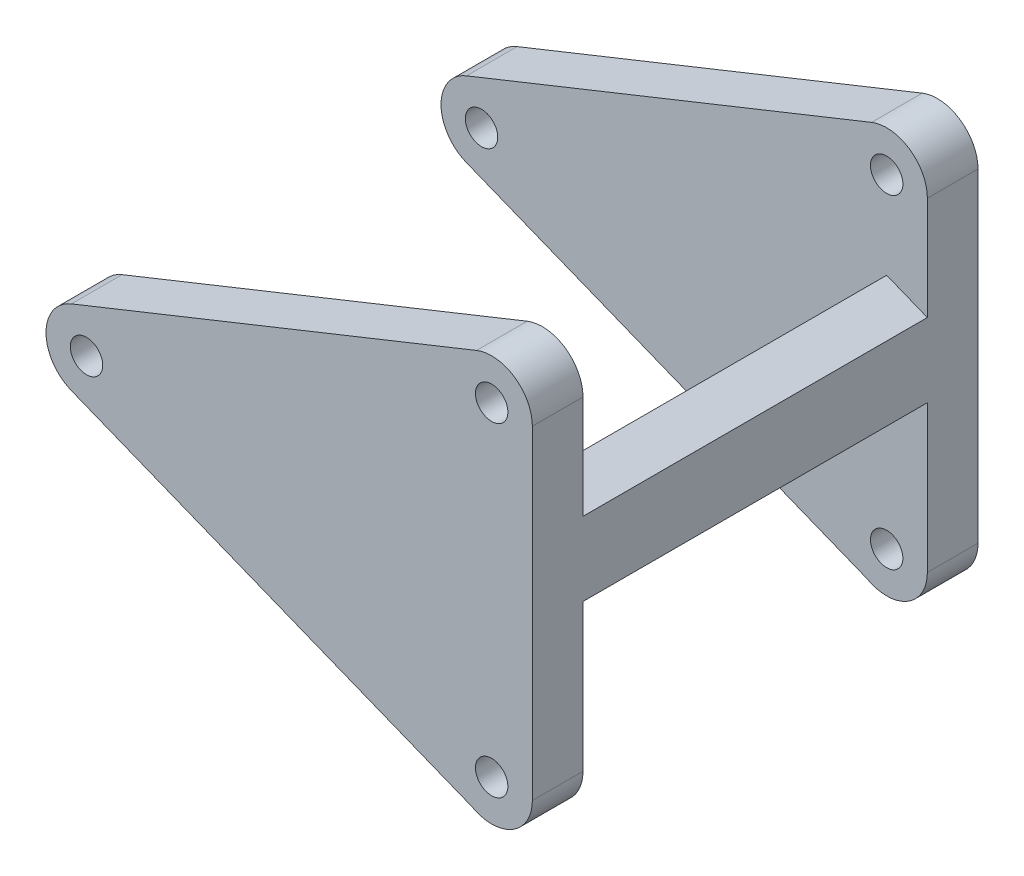
ISO-10303-21;
HEADER;
FILE_DESCRIPTION(('STEP AP214'),'2;1');
FILE_NAME('part.step','',(''),(''),'','','');
FILE_SCHEMA(('AUTOMOTIVE_DESIGN { 1 0 10303 214 1 1 1 1 }'));
ENDSEC;
DATA;
#1=APPLICATION_CONTEXT('core data for automotive mechanical design processes');
#2=APPLICATION_PROTOCOL_DEFINITION('international standard','automotive_design',2000,#1);
#3=PRODUCT_CONTEXT('',#1,'mechanical');
#4=PRODUCT('Part','Part','',(#3));
#5=PRODUCT_RELATED_PRODUCT_CATEGORY('part','',(#4));
#6=PRODUCT_DEFINITION_FORMATION('','',#4);
#7=PRODUCT_DEFINITION_CONTEXT('part definition',#1,'design');
#8=PRODUCT_DEFINITION('design','',#6,#7);
#9=PRODUCT_DEFINITION_SHAPE('','',#8);
#10=(LENGTH_UNIT() NAMED_UNIT(*) SI_UNIT(.MILLI.,.METRE.));
#11=(NAMED_UNIT(*) PLANE_ANGLE_UNIT() SI_UNIT($,.RADIAN.));
#12=(NAMED_UNIT(*) SI_UNIT($,.STERADIAN.) SOLID_ANGLE_UNIT());
#13=UNCERTAINTY_MEASURE_WITH_UNIT(LENGTH_MEASURE(1.E-05),#10,'distance_accuracy_value','');
#14=(GEOMETRIC_REPRESENTATION_CONTEXT(3) GLOBAL_UNCERTAINTY_ASSIGNED_CONTEXT((#13)) GLOBAL_UNIT_ASSIGNED_CONTEXT((#10,
#11,#12)) REPRESENTATION_CONTEXT('',''));
#15=CARTESIAN_POINT('',(0.,0.,0.));
#16=DIRECTION('',(0.,0.,1.));
#17=DIRECTION('',(1.,0.,0.));
#18=AXIS2_PLACEMENT_3D('',#15,#16,#17);
#19=CARTESIAN_POINT('',(30.,-20.,0.));
#20=DIRECTION('',(0.,0.,1.));
#21=DIRECTION('',(1.,0.,0.));
#22=AXIS2_PLACEMENT_3D('',#19,#20,#21);
#23=CYLINDRICAL_SURFACE('',#22,2.);
#24=CARTESIAN_POINT('',(30.,-20.,0.));
#25=DIRECTION('',(0.,0.,1.));
#26=DIRECTION('',(1.,0.,0.));
#27=AXIS2_PLACEMENT_3D('',#24,#25,#26);
#28=CIRCLE('',#27,2.);
#29=CARTESIAN_POINT('',(32.,-20.,0.));
#30=VERTEX_POINT('',#29);
#31=EDGE_CURVE('E211',#30,#30,#28,.T.);
#32=ORIENTED_EDGE('',*,*,#31,.F.);
#33=EDGE_LOOP('',(#32));
#34=FACE_BOUND('',#33,.T.);
#35=CARTESIAN_POINT('',(30.,-20.,6.25));
#36=DIRECTION('',(0.,0.,-1.));
#37=DIRECTION('',(-1.,0.,0.));
#38=AXIS2_PLACEMENT_3D('',#35,#36,#37);
#39=CIRCLE('',#38,2.);
#40=CARTESIAN_POINT('',(28.,-20.,6.25));
#41=VERTEX_POINT('',#40);
#42=EDGE_CURVE('E148',#41,#41,#39,.F.);
#43=ORIENTED_EDGE('',*,*,#42,.T.);
#44=EDGE_LOOP('',(#43));
#45=FACE_BOUND('',#44,.T.);
#46=ADVANCED_FACE('F16',(#34,#45),#23,.F.);
#47=CARTESIAN_POINT('',(30.,-20.,55.));
#48=DIRECTION('',(0.,0.,-1.));
#49=DIRECTION('',(-1.,0.,0.));
#50=AXIS2_PLACEMENT_3D('',#47,#48,#49);
#51=CYLINDRICAL_SURFACE('',#50,5.02210597414604);
#52=CARTESIAN_POINT('',(30.,-20.,48.75));
#53=DIRECTION('',(0.,0.,1.));
#54=DIRECTION('',(1.,0.,0.));
#55=AXIS2_PLACEMENT_3D('',#52,#53,#54);
#56=CIRCLE('',#55,5.02210597414604);
#57=CARTESIAN_POINT('',(27.5325788494892,-24.3741720681251,48.75));
#58=VERTEX_POINT('',#57);
#59=CARTESIAN_POINT('',(35.0221059741461,-20.,48.75));
#60=VERTEX_POINT('',#59);
#61=EDGE_CURVE('E199',#58,#60,#56,.T.);
#62=ORIENTED_EDGE('',*,*,#61,.T.);
#63=DIRECTION('',(0.,0.,-1.));
#64=VECTOR('',#63,1.);
#65=CARTESIAN_POINT('',(35.0221059741461,-20.,55.));
#66=LINE('',#65,#64);
#67=CARTESIAN_POINT('',(35.0221059741461,-20.,55.));
#68=VERTEX_POINT('',#67);
#69=EDGE_CURVE('E144',#68,#60,#66,.T.);
#70=ORIENTED_EDGE('',*,*,#69,.F.);
#71=CARTESIAN_POINT('',(30.,-20.,55.));
#72=DIRECTION('',(0.,0.,1.));
#73=DIRECTION('',(1.,0.,0.));
#74=AXIS2_PLACEMENT_3D('',#71,#72,#73);
#75=CIRCLE('',#74,5.02210597414604);
#76=CARTESIAN_POINT('',(27.5325788494892,-24.3741720681251,55.));
#77=VERTEX_POINT('',#76);
#78=EDGE_CURVE('E79',#77,#68,#75,.T.);
#79=ORIENTED_EDGE('',*,*,#78,.F.);
#80=DIRECTION('',(0.,0.,-1.));
#81=VECTOR('',#80,1.);
#82=CARTESIAN_POINT('',(27.5325788494892,-24.3741720681251,55.));
#83=LINE('',#82,#81);
#84=EDGE_CURVE('E10',#77,#58,#83,.T.);
#85=ORIENTED_EDGE('',*,*,#84,.T.);
#86=EDGE_LOOP('',(#62,#70,#79,#85));
#87=FACE_BOUND('',#86,.T.);
#88=ADVANCED_FACE('F222',(#87),#51,.T.);
#89=CARTESIAN_POINT('',(30.,20.,0.));
#90=DIRECTION('',(0.,0.,1.));
#91=DIRECTION('',(1.,0.,0.));
#92=AXIS2_PLACEMENT_3D('',#89,#90,#91);
#93=CYLINDRICAL_SURFACE('',#92,2.);
#94=CARTESIAN_POINT('',(30.,20.,0.));
#95=DIRECTION('',(0.,0.,1.));
#96=DIRECTION('',(1.,0.,0.));
#97=AXIS2_PLACEMENT_3D('',#94,#95,#96);
#98=CIRCLE('',#97,2.);
#99=CARTESIAN_POINT('',(32.,20.,0.));
#100=VERTEX_POINT('',#99);
#101=EDGE_CURVE('E202',#100,#100,#98,.T.);
#102=ORIENTED_EDGE('',*,*,#101,.F.);
#103=EDGE_LOOP('',(#102));
#104=FACE_BOUND('',#103,.T.);
#105=CARTESIAN_POINT('',(30.,20.,6.25));
#106=DIRECTION('',(0.,0.,-1.));
#107=DIRECTION('',(-1.,0.,0.));
#108=AXIS2_PLACEMENT_3D('',#105,#106,#107);
#109=CIRCLE('',#108,2.);
#110=CARTESIAN_POINT('',(28.,20.,6.25));
#111=VERTEX_POINT('',#110);
#112=EDGE_CURVE('E153',#111,#111,#109,.F.);
#113=ORIENTED_EDGE('',*,*,#112,.T.);
#114=EDGE_LOOP('',(#113));
#115=FACE_BOUND('',#114,.T.);
#116=ADVANCED_FACE('F294',(#104,#115),#93,.F.);
#117=CARTESIAN_POINT('',(30.,20.,55.));
#118=DIRECTION('',(0.,0.,-1.));
#119=DIRECTION('',(-1.,0.,0.));
#120=AXIS2_PLACEMENT_3D('',#117,#118,#119);
#121=CYLINDRICAL_SURFACE('',#120,5.02210597415111);
#122=CARTESIAN_POINT('',(30.,20.,6.25));
#123=DIRECTION('',(0.,0.,-1.));
#124=DIRECTION('',(-1.,0.,0.));
#125=AXIS2_PLACEMENT_3D('',#122,#123,#124);
#126=CIRCLE('',#125,5.02210597415111);
#127=CARTESIAN_POINT('',(28.1329227098459,24.6621422981441,6.25));
#128=VERTEX_POINT('',#127);
#129=CARTESIAN_POINT('',(35.0221059741511,20.,6.25));
#130=VERTEX_POINT('',#129);
#131=EDGE_CURVE('E175',#128,#130,#126,.T.);
#132=ORIENTED_EDGE('',*,*,#131,.T.);
#133=DIRECTION('',(0.,0.,-1.));
#134=VECTOR('',#133,1.);
#135=CARTESIAN_POINT('',(35.0221059741562,20.,55.));
#136=LINE('',#135,#134);
#137=CARTESIAN_POINT('',(35.0221059741562,20.,0.));
#138=VERTEX_POINT('',#137);
#139=EDGE_CURVE('E108',#130,#138,#136,.T.);
#140=ORIENTED_EDGE('',*,*,#139,.T.);
#141=CARTESIAN_POINT('',(30.,20.,0.));
#142=DIRECTION('',(0.,0.,1.));
#143=DIRECTION('',(1.,0.,0.));
#144=AXIS2_PLACEMENT_3D('',#141,#142,#143);
#145=CIRCLE('',#144,5.02210597415111);
#146=CARTESIAN_POINT('',(28.1329227098459,24.6621422981441,0.));
#147=VERTEX_POINT('',#146);
#148=EDGE_CURVE('E127',#138,#147,#145,.T.);
#149=ORIENTED_EDGE('',*,*,#148,.T.);
#150=DIRECTION('',(0.,0.,-1.));
#151=VECTOR('',#150,1.);
#152=CARTESIAN_POINT('',(28.1329227098459,24.6621422981441,55.));
#153=LINE('',#152,#151);
#154=EDGE_CURVE('E109',#128,#147,#153,.T.);
#155=ORIENTED_EDGE('',*,*,#154,.F.);
#156=EDGE_LOOP('',(#132,#140,#149,#155));
#157=FACE_BOUND('',#156,.T.);
#158=ADVANCED_FACE('F340',(#157),#121,.T.);
#159=CARTESIAN_POINT('',(30.,-7.58962820730425E-12,0.));
#160=DIRECTION('',(-1.,2.53226413026867E-13,0.));
#161=DIRECTION('',(-2.53226413026867E-13,-1.,0.));
#162=AXIS2_PLACEMENT_3D('',#159,#160,#161);
#163=PLANE('',#162);
#164=DIRECTION('',(0.,0.,-1.));
#165=VECTOR('',#164,1.);
#166=CARTESIAN_POINT('',(29.9999999999991,-3.86566383928058,0.));
#167=LINE('',#166,#165);
#168=CARTESIAN_POINT('',(29.9999999999991,-3.86566383928056,48.75));
#169=VERTEX_POINT('',#168);
#170=CARTESIAN_POINT('',(29.9999999999991,-3.86566383928057,6.25));
#171=VERTEX_POINT('',#170);
#172=EDGE_CURVE('E353',#169,#171,#167,.T.);
#173=ORIENTED_EDGE('',*,*,#172,.F.);
#174=DIRECTION('',(2.53117450890287E-13,1.,0.));
#175=VECTOR('',#174,1.);
#176=CARTESIAN_POINT('',(29.9999999999913,-34.3053145747026,48.75));
#177=LINE('',#176,#175);
#178=CARTESIAN_POINT('',(30.0000000000063,9.2552808452868,48.75));
#179=VERTEX_POINT('',#178);
#180=EDGE_CURVE('E149',#169,#179,#177,.T.);
#181=ORIENTED_EDGE('',*,*,#180,.T.);
#182=DIRECTION('',(0.,0.,-1.));
#183=VECTOR('',#182,1.);
#184=CARTESIAN_POINT('',(30.0000000000024,9.25528084528839,0.));
#185=LINE('',#184,#183);
#186=CARTESIAN_POINT('',(30.0000000000023,9.2552808452884,6.25));
#187=VERTEX_POINT('',#186);
#188=EDGE_CURVE('E371',#179,#187,#185,.T.);
#189=ORIENTED_EDGE('',*,*,#188,.T.);
#190=DIRECTION('',(-2.53226413026867E-13,-1.,0.));
#191=VECTOR('',#190,1.);
#192=CARTESIAN_POINT('',(30.0000000000088,34.5579796205685,6.25));
#193=LINE('',#192,#191);
#194=EDGE_CURVE('E156',#187,#171,#193,.T.);
#195=ORIENTED_EDGE('',*,*,#194,.T.);
#196=EDGE_LOOP('',(#173,#181,#189,#195));
#197=FACE_BOUND('',#196,.T.);
#198=ADVANCED_FACE('F337',(#197),#163,.T.);
#199=CARTESIAN_POINT('',(-4.60784441691814,-11.5336366510643,55.));
#200=DIRECTION('',(0.371001238912966,0.928632371137817,0.));
#201=DIRECTION('',(-0.928632371137817,0.371001238912966,0.));
#202=AXIS2_PLACEMENT_3D('',#199,#200,#201);
#203=PLANE('',#202);
#204=DIRECTION('',(0.,0.,-1.));
#205=VECTOR('',#204,1.);
#206=CARTESIAN_POINT('',(-21.8569533817705,-4.6423834544263,55.));
#207=LINE('',#206,#205);
#208=CARTESIAN_POINT('',(-21.8569533817705,-4.6423834544263,55.));
#209=VERTEX_POINT('',#208);
#210=CARTESIAN_POINT('',(-21.8569533817705,-4.6423834544263,48.75));
#211=VERTEX_POINT('',#210);
#212=EDGE_CURVE('E136',#209,#211,#207,.T.);
#213=ORIENTED_EDGE('',*,*,#212,.T.);
#214=DIRECTION('',(0.928632371137817,-0.371001238912966,0.));
#215=VECTOR('',#214,1.);
#216=CARTESIAN_POINT('',(-4.60784441691814,-11.5336366510643,48.75));
#217=LINE('',#216,#215);
#218=EDGE_CURVE('E196',#211,#58,#217,.T.);
#219=ORIENTED_EDGE('',*,*,#218,.T.);
#220=ORIENTED_EDGE('',*,*,#84,.F.);
#221=DIRECTION('',(0.928632371137817,-0.371001238912966,0.));
#222=VECTOR('',#221,1.);
#223=CARTESIAN_POINT('',(-4.60784441691814,-11.5336366510643,55.));
#224=LINE('',#223,#222);
#225=EDGE_CURVE('E135',#209,#77,#224,.T.);
#226=ORIENTED_EDGE('',*,*,#225,.F.);
#227=EDGE_LOOP('',(#213,#219,#220,#226));
#228=FACE_BOUND('',#227,.T.);
#229=ADVANCED_FACE('F264',(#228),#203,.F.);
#230=CARTESIAN_POINT('',(-4.62314407872176,11.5441153258547,55.));
#231=DIRECTION('',(-0.371771782548172,0.928324157663127,0.));
#232=DIRECTION('',(-0.928324157663127,-0.371771782548172,0.));
#233=AXIS2_PLACEMENT_3D('',#230,#231,#232);
#234=PLANE('',#233);
#235=DIRECTION('',(0.928324157663127,0.371771782548172,0.));
#236=VECTOR('',#235,1.);
#237=CARTESIAN_POINT('',(-4.62314407872176,11.5441153258547,48.75));
#238=LINE('',#237,#236);
#239=CARTESIAN_POINT('',(-21.8588589127408,4.64162078831564,48.75));
#240=VERTEX_POINT('',#239);
#241=CARTESIAN_POINT('',(28.1329227098459,24.6621422981441,48.75));
#242=VERTEX_POINT('',#241);
#243=EDGE_CURVE('E192',#240,#242,#238,.T.);
#244=ORIENTED_EDGE('',*,*,#243,.F.);
#245=DIRECTION('',(0.,0.,-1.));
#246=VECTOR('',#245,1.);
#247=CARTESIAN_POINT('',(-21.8588589127408,4.64162078831564,55.));
#248=LINE('',#247,#246);
#249=CARTESIAN_POINT('',(-21.8588589127408,4.64162078831564,55.));
#250=VERTEX_POINT('',#249);
#251=EDGE_CURVE('E113',#250,#240,#248,.T.);
#252=ORIENTED_EDGE('',*,*,#251,.F.);
#253=DIRECTION('',(0.928324157663127,0.371771782548172,0.));
#254=VECTOR('',#253,1.);
#255=CARTESIAN_POINT('',(-4.62314407872176,11.5441153258547,55.));
#256=LINE('',#255,#254);
#257=CARTESIAN_POINT('',(28.1329227098459,24.6621422981441,55.));
#258=VERTEX_POINT('',#257);
#259=EDGE_CURVE('E92',#250,#258,#256,.T.);
#260=ORIENTED_EDGE('',*,*,#259,.T.);
#261=EDGE_CURVE('E101',#258,#242,#153,.T.);
#262=ORIENTED_EDGE('',*,*,#261,.T.);
#263=EDGE_LOOP('',(#244,#252,#260,#262));
#264=FACE_BOUND('',#263,.T.);
#265=ADVANCED_FACE('F111',(#264),#234,.T.);
#266=CARTESIAN_POINT('',(-20.,0.,55.));
#267=DIRECTION('',(0.,0.,-1.));
#268=DIRECTION('',(-1.,0.,0.));
#269=AXIS2_PLACEMENT_3D('',#266,#267,#268);
#270=CYLINDRICAL_SURFACE('',#269,5.);
#271=CARTESIAN_POINT('',(-20.,0.,6.25));
#272=DIRECTION('',(0.,0.,-1.));
#273=DIRECTION('',(-1.,0.,0.));
#274=AXIS2_PLACEMENT_3D('',#271,#272,#273);
#275=CIRCLE('',#274,5.);
#276=CARTESIAN_POINT('',(-21.8569533817705,-4.6423834544263,6.25));
#277=VERTEX_POINT('',#276);
#278=CARTESIAN_POINT('',(-21.8588589127408,4.64162078831564,6.25));
#279=VERTEX_POINT('',#278);
#280=EDGE_CURVE('E169',#277,#279,#275,.T.);
#281=ORIENTED_EDGE('',*,*,#280,.T.);
#282=CARTESIAN_POINT('',(-21.8588589127408,4.64162078831564,0.));
#283=VERTEX_POINT('',#282);
#284=EDGE_CURVE('E139',#279,#283,#248,.T.);
#285=ORIENTED_EDGE('',*,*,#284,.T.);
#286=CARTESIAN_POINT('',(-20.,0.,0.));
#287=DIRECTION('',(0.,0.,1.));
#288=DIRECTION('',(1.,0.,0.));
#289=AXIS2_PLACEMENT_3D('',#286,#287,#288);
#290=CIRCLE('',#289,5.);
#291=CARTESIAN_POINT('',(-21.8569533817705,-4.6423834544263,0.));
#292=VERTEX_POINT('',#291);
#293=EDGE_CURVE('E133',#283,#292,#290,.T.);
#294=ORIENTED_EDGE('',*,*,#293,.T.);
#295=EDGE_CURVE('E71',#277,#292,#207,.T.);
#296=ORIENTED_EDGE('',*,*,#295,.F.);
#297=EDGE_LOOP('',(#281,#285,#294,#296));
#298=FACE_BOUND('',#297,.T.);
#299=ADVANCED_FACE('F270',(#298),#270,.T.);
#300=CARTESIAN_POINT('',(30.,20.,55.));
#301=DIRECTION('',(0.,0.,1.));
#302=DIRECTION('',(1.,0.,0.));
#303=AXIS2_PLACEMENT_3D('',#300,#301,#302);
#304=CIRCLE('',#303,2.);
#305=CARTESIAN_POINT('',(32.,20.,55.));
#306=VERTEX_POINT('',#305);
#307=EDGE_CURVE('E214',#306,#306,#304,.T.);
#308=ORIENTED_EDGE('',*,*,#307,.T.);
#309=EDGE_LOOP('',(#308));
#310=FACE_BOUND('',#309,.T.);
#311=CARTESIAN_POINT('',(30.,20.,48.75));
#312=DIRECTION('',(0.,0.,1.));
#313=DIRECTION('',(1.,0.,0.));
#314=AXIS2_PLACEMENT_3D('',#311,#312,#313);
#315=CIRCLE('',#314,2.);
#316=CARTESIAN_POINT('',(32.,20.,48.75));
#317=VERTEX_POINT('',#316);
#318=EDGE_CURVE('E186',#317,#317,#315,.F.);
#319=ORIENTED_EDGE('',*,*,#318,.T.);
#320=EDGE_LOOP('',(#319));
#321=FACE_BOUND('',#320,.T.);
#322=ADVANCED_FACE('F284',(#310,#321),#93,.F.);
#323=CARTESIAN_POINT('',(30.,-20.,55.));
#324=DIRECTION('',(0.,0.,1.));
#325=DIRECTION('',(1.,0.,0.));
#326=AXIS2_PLACEMENT_3D('',#323,#324,#325);
#327=CIRCLE('',#326,2.);
#328=CARTESIAN_POINT('',(32.,-20.,55.));
#329=VERTEX_POINT('',#328);
#330=EDGE_CURVE('E208',#329,#329,#327,.T.);
#331=ORIENTED_EDGE('',*,*,#330,.T.);
#332=EDGE_LOOP('',(#331));
#333=FACE_BOUND('',#332,.T.);
#334=CARTESIAN_POINT('',(30.,-20.,48.75));
#335=DIRECTION('',(0.,0.,1.));
#336=DIRECTION('',(1.,0.,0.));
#337=AXIS2_PLACEMENT_3D('',#334,#335,#336);
#338=CIRCLE('',#337,2.);
#339=CARTESIAN_POINT('',(32.,-20.,48.75));
#340=VERTEX_POINT('',#339);
#341=EDGE_CURVE('E183',#340,#340,#338,.F.);
#342=ORIENTED_EDGE('',*,*,#341,.T.);
#343=EDGE_LOOP('',(#342));
#344=FACE_BOUND('',#343,.T.);
#345=ADVANCED_FACE('F289',(#333,#344),#23,.F.);
#346=CARTESIAN_POINT('',(-20.,0.,0.));
#347=DIRECTION('',(0.,0.,1.));
#348=DIRECTION('',(1.,0.,0.));
#349=AXIS2_PLACEMENT_3D('',#346,#347,#348);
#350=CYLINDRICAL_SURFACE('',#349,2.);
#351=CARTESIAN_POINT('',(-20.,0.,48.75));
#352=DIRECTION('',(0.,0.,1.));
#353=DIRECTION('',(1.,0.,0.));
#354=AXIS2_PLACEMENT_3D('',#351,#352,#353);
#355=CIRCLE('',#354,2.);
#356=CARTESIAN_POINT('',(-18.,0.,48.75));
#357=VERTEX_POINT('',#356);
#358=EDGE_CURVE('E20',#357,#357,#355,.F.);
#359=ORIENTED_EDGE('',*,*,#358,.T.);
#360=EDGE_LOOP('',(#359));
#361=FACE_BOUND('',#360,.T.);
#362=CARTESIAN_POINT('',(-20.,0.,55.));
#363=DIRECTION('',(0.,0.,1.));
#364=DIRECTION('',(1.,0.,0.));
#365=AXIS2_PLACEMENT_3D('',#362,#363,#364);
#366=CIRCLE('',#365,2.);
#367=CARTESIAN_POINT('',(-18.,0.,55.));
#368=VERTEX_POINT('',#367);
#369=EDGE_CURVE('E205',#368,#368,#366,.T.);
#370=ORIENTED_EDGE('',*,*,#369,.T.);
#371=EDGE_LOOP('',(#370));
#372=FACE_BOUND('',#371,.T.);
#373=ADVANCED_FACE('F301',(#361,#372),#350,.F.);
#374=CARTESIAN_POINT('',(27.5325788494892,-24.3741720681251,6.25));
#375=VERTEX_POINT('',#374);
#376=CARTESIAN_POINT('',(27.5325788494892,-24.3741720681251,0.));
#377=VERTEX_POINT('',#376);
#378=EDGE_CURVE('E25',#375,#377,#83,.T.);
#379=ORIENTED_EDGE('',*,*,#378,.F.);
#380=DIRECTION('',(-0.928632371137817,0.371001238912966,0.));
#381=VECTOR('',#380,1.);
#382=CARTESIAN_POINT('',(-4.60784441691814,-11.5336366510643,6.25));
#383=LINE('',#382,#381);
#384=EDGE_CURVE('E178',#375,#277,#383,.T.);
#385=ORIENTED_EDGE('',*,*,#384,.T.);
#386=ORIENTED_EDGE('',*,*,#295,.T.);
#387=DIRECTION('',(0.928632371137817,-0.371001238912966,0.));
#388=VECTOR('',#387,1.);
#389=CARTESIAN_POINT('',(-4.60784441691814,-11.5336366510643,0.));
#390=LINE('',#389,#388);
#391=EDGE_CURVE('E118',#292,#377,#390,.T.);
#392=ORIENTED_EDGE('',*,*,#391,.T.);
#393=EDGE_LOOP('',(#379,#385,#386,#392));
#394=FACE_BOUND('',#393,.T.);
#395=ADVANCED_FACE('F18',(#394),#203,.F.);
#396=CARTESIAN_POINT('',(35.0221059741461,-20.,6.25));
#397=VERTEX_POINT('',#396);
#398=CARTESIAN_POINT('',(35.0221059741461,-20.,0.));
#399=VERTEX_POINT('',#398);
#400=EDGE_CURVE('E143',#397,#399,#66,.T.);
#401=ORIENTED_EDGE('',*,*,#400,.F.);
#402=CARTESIAN_POINT('',(30.,-20.,6.25));
#403=DIRECTION('',(0.,0.,-1.));
#404=DIRECTION('',(-1.,0.,0.));
#405=AXIS2_PLACEMENT_3D('',#402,#403,#404);
#406=CIRCLE('',#405,5.02210597414604);
#407=EDGE_CURVE('E180',#397,#375,#406,.T.);
#408=ORIENTED_EDGE('',*,*,#407,.T.);
#409=ORIENTED_EDGE('',*,*,#378,.T.);
#410=CARTESIAN_POINT('',(30.,-20.,0.));
#411=DIRECTION('',(0.,0.,1.));
#412=DIRECTION('',(1.,0.,0.));
#413=AXIS2_PLACEMENT_3D('',#410,#411,#412);
#414=CIRCLE('',#413,5.02210597414604);
#415=EDGE_CURVE('E120',#377,#399,#414,.T.);
#416=ORIENTED_EDGE('',*,*,#415,.T.);
#417=EDGE_LOOP('',(#401,#408,#409,#416));
#418=FACE_BOUND('',#417,.T.);
#419=ADVANCED_FACE('F295',(#418),#51,.T.);
#420=CARTESIAN_POINT('',(35.0221059741511,-8.86396036713895E-12,55.));
#421=DIRECTION('',(-1.,2.53096155145017E-13,0.));
#422=DIRECTION('',(-2.53096155145017E-13,-1.,0.));
#423=AXIS2_PLACEMENT_3D('',#420,#421,#422);
#424=PLANE('',#423);
#425=DIRECTION('',(0.,0.,-1.));
#426=VECTOR('',#425,1.);
#427=CARTESIAN_POINT('',(35.0221059741507,-1.85442964404414,55.));
#428=LINE('',#427,#426);
#429=CARTESIAN_POINT('',(35.0221059741507,-1.85442964404412,48.75));
#430=VERTEX_POINT('',#429);
#431=CARTESIAN_POINT('',(35.0221059741507,-1.85442964404412,6.25));
#432=VERTEX_POINT('',#431);
#433=EDGE_CURVE('E361',#430,#432,#428,.T.);
#434=ORIENTED_EDGE('',*,*,#433,.T.);
#435=DIRECTION('',(-2.53096155145017E-13,-1.,0.));
#436=VECTOR('',#435,1.);
#437=CARTESIAN_POINT('',(35.0221059741511,-8.86396036713895E-12,6.25));
#438=LINE('',#437,#436);
#439=EDGE_CURVE('E369',#432,#397,#438,.T.);
#440=ORIENTED_EDGE('',*,*,#439,.T.);
#441=ORIENTED_EDGE('',*,*,#400,.T.);
#442=DIRECTION('',(2.53096155145016E-13,1.,0.));
#443=VECTOR('',#442,1.);
#444=CARTESIAN_POINT('',(35.0221059741511,-8.86396036713895E-12,0.));
#445=LINE('',#444,#443);
#446=EDGE_CURVE('E124',#399,#138,#445,.T.);
#447=ORIENTED_EDGE('',*,*,#446,.T.);
#448=ORIENTED_EDGE('',*,*,#139,.F.);
#449=DIRECTION('',(-2.53096155145017E-13,-1.,0.));
#450=VECTOR('',#449,1.);
#451=CARTESIAN_POINT('',(35.0221059741511,-8.86396036713895E-12,6.25));
#452=LINE('',#451,#450);
#453=CARTESIAN_POINT('',(35.022105974153,7.2488813310445,6.25));
#454=VERTEX_POINT('',#453);
#455=EDGE_CURVE('E163',#130,#454,#452,.T.);
#456=ORIENTED_EDGE('',*,*,#455,.T.);
#457=DIRECTION('',(0.,0.,-1.));
#458=VECTOR('',#457,1.);
#459=CARTESIAN_POINT('',(35.022105974153,7.24888133104451,55.));
#460=LINE('',#459,#458);
#461=CARTESIAN_POINT('',(35.022105974153,7.2488813310445,48.75));
#462=VERTEX_POINT('',#461);
#463=EDGE_CURVE('E374',#462,#454,#460,.T.);
#464=ORIENTED_EDGE('',*,*,#463,.F.);
#465=DIRECTION('',(2.53096155145017E-13,1.,0.));
#466=VECTOR('',#465,1.);
#467=CARTESIAN_POINT('',(35.0221059741511,-8.86396036713895E-12,48.75));
#468=LINE('',#467,#466);
#469=CARTESIAN_POINT('',(35.0221059741511,20.,48.75));
#470=VERTEX_POINT('',#469);
#471=EDGE_CURVE('E234',#462,#470,#468,.T.);
#472=ORIENTED_EDGE('',*,*,#471,.T.);
#473=CARTESIAN_POINT('',(35.0221059741562,20.,55.));
#474=VERTEX_POINT('',#473);
#475=EDGE_CURVE('E141',#474,#470,#136,.T.);
#476=ORIENTED_EDGE('',*,*,#475,.F.);
#477=DIRECTION('',(2.53096155145016E-13,1.,0.));
#478=VECTOR('',#477,1.);
#479=CARTESIAN_POINT('',(35.0221059741511,-8.86396036713895E-12,55.));
#480=LINE('',#479,#478);
#481=EDGE_CURVE('E94',#68,#474,#480,.T.);
#482=ORIENTED_EDGE('',*,*,#481,.F.);
#483=ORIENTED_EDGE('',*,*,#69,.T.);
#484=DIRECTION('',(2.53096155145017E-13,1.,0.));
#485=VECTOR('',#484,1.);
#486=CARTESIAN_POINT('',(35.0221059741511,-8.86396036713895E-12,48.75));
#487=LINE('',#486,#485);
#488=EDGE_CURVE('E262',#60,#430,#487,.T.);
#489=ORIENTED_EDGE('',*,*,#488,.T.);
#490=EDGE_LOOP('',(#434,#440,#441,#447,#448,#456,#464,#472,#476,#482,#483,#489));
#491=FACE_BOUND('',#490,.T.);
#492=ADVANCED_FACE('F229',(#491),#424,.F.);
#493=ORIENTED_EDGE('',*,*,#475,.T.);
#494=CARTESIAN_POINT('',(30.,20.,48.75));
#495=DIRECTION('',(0.,0.,1.));
#496=DIRECTION('',(1.,0.,0.));
#497=AXIS2_PLACEMENT_3D('',#494,#495,#496);
#498=CIRCLE('',#497,5.02210597415111);
#499=EDGE_CURVE('E105',#470,#242,#498,.T.);
#500=ORIENTED_EDGE('',*,*,#499,.T.);
#501=ORIENTED_EDGE('',*,*,#261,.F.);
#502=CARTESIAN_POINT('',(30.,20.,55.));
#503=DIRECTION('',(0.,0.,1.));
#504=DIRECTION('',(1.,0.,0.));
#505=AXIS2_PLACEMENT_3D('',#502,#503,#504);
#506=CIRCLE('',#505,5.02210597415111);
#507=EDGE_CURVE('E88',#474,#258,#506,.T.);
#508=ORIENTED_EDGE('',*,*,#507,.F.);
#509=EDGE_LOOP('',(#493,#500,#501,#508));
#510=FACE_BOUND('',#509,.T.);
#511=ADVANCED_FACE('F102',(#510),#121,.T.);
#512=DIRECTION('',(-0.928324157663127,-0.371771782548172,0.));
#513=VECTOR('',#512,1.);
#514=CARTESIAN_POINT('',(-4.62314407872176,11.5441153258547,6.25));
#515=LINE('',#514,#513);
#516=EDGE_CURVE('E172',#128,#279,#515,.T.);
#517=ORIENTED_EDGE('',*,*,#516,.F.);
#518=ORIENTED_EDGE('',*,*,#154,.T.);
#519=DIRECTION('',(0.928324157663127,0.371771782548172,0.));
#520=VECTOR('',#519,1.);
#521=CARTESIAN_POINT('',(-4.62314407872176,11.5441153258547,0.));
#522=LINE('',#521,#520);
#523=EDGE_CURVE('E130',#283,#147,#522,.T.);
#524=ORIENTED_EDGE('',*,*,#523,.F.);
#525=ORIENTED_EDGE('',*,*,#284,.F.);
#526=EDGE_LOOP('',(#517,#518,#524,#525));
#527=FACE_BOUND('',#526,.T.);
#528=ADVANCED_FACE('F268',(#527),#234,.T.);
#529=CARTESIAN_POINT('',(-20.,0.,48.75));
#530=DIRECTION('',(0.,0.,1.));
#531=DIRECTION('',(1.,0.,0.));
#532=AXIS2_PLACEMENT_3D('',#529,#530,#531);
#533=CIRCLE('',#532,5.);
#534=EDGE_CURVE('E189',#240,#211,#533,.T.);
#535=ORIENTED_EDGE('',*,*,#534,.T.);
#536=ORIENTED_EDGE('',*,*,#212,.F.);
#537=CARTESIAN_POINT('',(-20.,0.,55.));
#538=DIRECTION('',(0.,0.,1.));
#539=DIRECTION('',(1.,0.,0.));
#540=AXIS2_PLACEMENT_3D('',#537,#538,#539);
#541=CIRCLE('',#540,5.);
#542=EDGE_CURVE('E42',#250,#209,#541,.T.);
#543=ORIENTED_EDGE('',*,*,#542,.F.);
#544=ORIENTED_EDGE('',*,*,#251,.T.);
#545=EDGE_LOOP('',(#535,#536,#543,#544));
#546=FACE_BOUND('',#545,.T.);
#547=ADVANCED_FACE('F266',(#546),#270,.T.);
#548=CARTESIAN_POINT('',(0.,0.,55.));
#549=DIRECTION('',(0.,0.,1.));
#550=DIRECTION('',(1.,0.,0.));
#551=AXIS2_PLACEMENT_3D('',#548,#549,#550);
#552=PLANE('',#551);
#553=ORIENTED_EDGE('',*,*,#369,.F.);
#554=EDGE_LOOP('',(#553));
#555=FACE_BOUND('',#554,.T.);
#556=ORIENTED_EDGE('',*,*,#330,.F.);
#557=EDGE_LOOP('',(#556));
#558=FACE_BOUND('',#557,.T.);
#559=ORIENTED_EDGE('',*,*,#307,.F.);
#560=EDGE_LOOP('',(#559));
#561=FACE_BOUND('',#560,.T.);
#562=ORIENTED_EDGE('',*,*,#225,.T.);
#563=ORIENTED_EDGE('',*,*,#78,.T.);
#564=ORIENTED_EDGE('',*,*,#481,.T.);
#565=ORIENTED_EDGE('',*,*,#507,.T.);
#566=ORIENTED_EDGE('',*,*,#259,.F.);
#567=ORIENTED_EDGE('',*,*,#542,.T.);
#568=EDGE_LOOP('',(#562,#563,#564,#565,#566,#567));
#569=FACE_BOUND('',#568,.T.);
#570=ADVANCED_FACE('F90',(#555,#558,#561,#569),#552,.T.);
#571=CARTESIAN_POINT('',(0.,0.,0.));
#572=DIRECTION('',(0.,0.,1.));
#573=DIRECTION('',(1.,0.,0.));
#574=AXIS2_PLACEMENT_3D('',#571,#572,#573);
#575=PLANE('',#574);
#576=CARTESIAN_POINT('',(-20.,0.,0.));
#577=DIRECTION('',(0.,0.,1.));
#578=DIRECTION('',(1.,0.,0.));
#579=AXIS2_PLACEMENT_3D('',#576,#577,#578);
#580=CIRCLE('',#579,2.);
#581=CARTESIAN_POINT('',(-18.,0.,0.));
#582=VERTEX_POINT('',#581);
#583=EDGE_CURVE('E121',#582,#582,#580,.T.);
#584=ORIENTED_EDGE('',*,*,#583,.T.);
#585=EDGE_LOOP('',(#584));
#586=FACE_BOUND('',#585,.T.);
#587=ORIENTED_EDGE('',*,*,#31,.T.);
#588=EDGE_LOOP('',(#587));
#589=FACE_BOUND('',#588,.T.);
#590=ORIENTED_EDGE('',*,*,#101,.T.);
#591=EDGE_LOOP('',(#590));
#592=FACE_BOUND('',#591,.T.);
#593=ORIENTED_EDGE('',*,*,#391,.F.);
#594=ORIENTED_EDGE('',*,*,#293,.F.);
#595=ORIENTED_EDGE('',*,*,#523,.T.);
#596=ORIENTED_EDGE('',*,*,#148,.F.);
#597=ORIENTED_EDGE('',*,*,#446,.F.);
#598=ORIENTED_EDGE('',*,*,#415,.F.);
#599=EDGE_LOOP('',(#593,#594,#595,#596,#597,#598));
#600=FACE_BOUND('',#599,.T.);
#601=ADVANCED_FACE('F277',(#586,#589,#592,#600),#575,.F.);
#602=CARTESIAN_POINT('',(-20.,0.,6.25));
#603=DIRECTION('',(0.,0.,-1.));
#604=DIRECTION('',(-1.,0.,0.));
#605=AXIS2_PLACEMENT_3D('',#602,#603,#604);
#606=CIRCLE('',#605,2.);
#607=CARTESIAN_POINT('',(-22.,0.,6.25));
#608=VERTEX_POINT('',#607);
#609=EDGE_CURVE('E146',#608,#608,#606,.F.);
#610=ORIENTED_EDGE('',*,*,#609,.T.);
#611=EDGE_LOOP('',(#610));
#612=FACE_BOUND('',#611,.T.);
#613=ORIENTED_EDGE('',*,*,#583,.F.);
#614=EDGE_LOOP('',(#613));
#615=FACE_BOUND('',#614,.T.);
#616=ADVANCED_FACE('F309',(#612,#615),#350,.F.);
#617=CARTESIAN_POINT('',(29.9999999999913,-34.3053145747026,48.75));
#618=DIRECTION('',(0.,0.,1.));
#619=DIRECTION('',(1.,0.,0.));
#620=AXIS2_PLACEMENT_3D('',#617,#618,#619);
#621=PLANE('',#620);
#622=ORIENTED_EDGE('',*,*,#180,.F.);
#623=DIRECTION('',(-0.928324157663127,-0.371771782548172,0.));
#624=VECTOR('',#623,1.);
#625=CARTESIAN_POINT('',(22.698388686511,-6.78978579719951,48.75));
#626=LINE('',#625,#624);
#627=EDGE_CURVE('E359',#430,#169,#626,.T.);
#628=ORIENTED_EDGE('',*,*,#627,.F.);
#629=ORIENTED_EDGE('',*,*,#488,.F.);
#630=ORIENTED_EDGE('',*,*,#61,.F.);
#631=ORIENTED_EDGE('',*,*,#218,.F.);
#632=ORIENTED_EDGE('',*,*,#534,.F.);
#633=ORIENTED_EDGE('',*,*,#243,.T.);
#634=ORIENTED_EDGE('',*,*,#499,.F.);
#635=ORIENTED_EDGE('',*,*,#471,.F.);
#636=DIRECTION('',(0.928632371137817,-0.371001238912966,0.));
#637=VECTOR('',#636,1.);
#638=CARTESIAN_POINT('',(24.5679541204021,11.4254569168963,48.75));
#639=LINE('',#638,#637);
#640=EDGE_CURVE('E377',#179,#462,#639,.T.);
#641=ORIENTED_EDGE('',*,*,#640,.F.);
#642=EDGE_LOOP('',(#622,#628,#629,#630,#631,#632,#633,#634,#635,#641));
#643=FACE_BOUND('',#642,.T.);
#644=ORIENTED_EDGE('',*,*,#341,.F.);
#645=EDGE_LOOP('',(#644));
#646=FACE_BOUND('',#645,.T.);
#647=ORIENTED_EDGE('',*,*,#358,.F.);
#648=EDGE_LOOP('',(#647));
#649=FACE_BOUND('',#648,.T.);
#650=ORIENTED_EDGE('',*,*,#318,.F.);
#651=EDGE_LOOP('',(#650));
#652=FACE_BOUND('',#651,.T.);
#653=ADVANCED_FACE('F259',(#643,#646,#649,#652),#621,.F.);
#654=CARTESIAN_POINT('',(30.0000000000063,25.0221059741511,6.25));
#655=DIRECTION('',(0.,0.,-1.));
#656=DIRECTION('',(-1.,0.,0.));
#657=AXIS2_PLACEMENT_3D('',#654,#655,#656);
#658=PLANE('',#657);
#659=ORIENTED_EDGE('',*,*,#42,.F.);
#660=EDGE_LOOP('',(#659));
#661=FACE_BOUND('',#660,.T.);
#662=ORIENTED_EDGE('',*,*,#112,.F.);
#663=EDGE_LOOP('',(#662));
#664=FACE_BOUND('',#663,.T.);
#665=ORIENTED_EDGE('',*,*,#407,.F.);
#666=ORIENTED_EDGE('',*,*,#439,.F.);
#667=DIRECTION('',(0.928324157663127,0.371771782548172,0.));
#668=VECTOR('',#667,1.);
#669=CARTESIAN_POINT('',(49.5304708994529,3.95582601462237,6.25));
#670=LINE('',#669,#668);
#671=EDGE_CURVE('E357',#171,#432,#670,.T.);
#672=ORIENTED_EDGE('',*,*,#671,.F.);
#673=ORIENTED_EDGE('',*,*,#194,.F.);
#674=DIRECTION('',(-0.928632371137817,0.371001238912966,0.));
#675=VECTOR('',#674,1.);
#676=CARTESIAN_POINT('',(24.5679541204021,11.4254569168963,6.25));
#677=LINE('',#676,#675);
#678=EDGE_CURVE('E33',#454,#187,#677,.T.);
#679=ORIENTED_EDGE('',*,*,#678,.F.);
#680=ORIENTED_EDGE('',*,*,#455,.F.);
#681=ORIENTED_EDGE('',*,*,#131,.F.);
#682=ORIENTED_EDGE('',*,*,#516,.T.);
#683=ORIENTED_EDGE('',*,*,#280,.F.);
#684=ORIENTED_EDGE('',*,*,#384,.F.);
#685=EDGE_LOOP('',(#665,#666,#672,#673,#679,#680,#681,#682,#683,#684));
#686=FACE_BOUND('',#685,.T.);
#687=ORIENTED_EDGE('',*,*,#609,.F.);
#688=EDGE_LOOP('',(#687));
#689=FACE_BOUND('',#688,.T.);
#690=ADVANCED_FACE('F316',(#661,#664,#686,#689),#658,.F.);
#691=CARTESIAN_POINT('',(7.31792173665277,18.3170790319194,0.));
#692=DIRECTION('',(0.371001238912966,0.928632371137817,0.));
#693=DIRECTION('',(-0.928632371137817,0.371001238912966,0.));
#694=AXIS2_PLACEMENT_3D('',#691,#692,#693);
#695=PLANE('',#694);
#696=ORIENTED_EDGE('',*,*,#463,.T.);
#697=ORIENTED_EDGE('',*,*,#678,.T.);
#698=ORIENTED_EDGE('',*,*,#188,.F.);
#699=ORIENTED_EDGE('',*,*,#640,.T.);
#700=EDGE_LOOP('',(#696,#697,#698,#699));
#701=FACE_BOUND('',#700,.T.);
#702=ADVANCED_FACE('F333',(#701),#695,.T.);
#703=CARTESIAN_POINT('',(5.48056392570104,-13.6851157852092,0.));
#704=DIRECTION('',(-0.371771782548172,0.928324157663127,0.));
#705=DIRECTION('',(-0.928324157663127,-0.371771782548172,0.));
#706=AXIS2_PLACEMENT_3D('',#703,#704,#705);
#707=PLANE('',#706);
#708=ORIENTED_EDGE('',*,*,#172,.T.);
#709=ORIENTED_EDGE('',*,*,#671,.T.);
#710=ORIENTED_EDGE('',*,*,#433,.F.);
#711=ORIENTED_EDGE('',*,*,#627,.T.);
#712=EDGE_LOOP('',(#708,#709,#710,#711));
#713=FACE_BOUND('',#712,.T.);
#714=ADVANCED_FACE('F343',(#713),#707,.F.);
#715=CLOSED_SHELL('',(#46,#88,#116,#158,#198,#229,#265,#299,#322,#345,#373,#395,#419,#492,#511,
#528,#547,#570,#601,#616,#653,#690,#702,#714));
#716=MANIFOLD_SOLID_BREP('B1',#715);
#717=ADVANCED_BREP_SHAPE_REPRESENTATION('',(#18,#716),#14);
#718=SHAPE_DEFINITION_REPRESENTATION(#9,#717);
ENDSEC;
END-ISO-10303-21;
